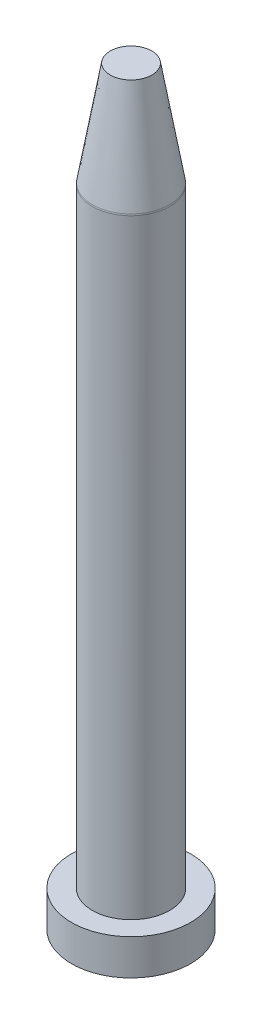
ISO-10303-21;
HEADER;
FILE_DESCRIPTION(('STEP AP214'),'2;1');
FILE_NAME('part.step','',(''),(''),'','','');
FILE_SCHEMA(('AUTOMOTIVE_DESIGN { 1 0 10303 214 1 1 1 1 }'));
ENDSEC;
DATA;
#1=APPLICATION_CONTEXT('core data for automotive mechanical design processes');
#2=APPLICATION_PROTOCOL_DEFINITION('international standard','automotive_design',2000,#1);
#3=PRODUCT_CONTEXT('',#1,'mechanical');
#4=PRODUCT('Part','Part','',(#3));
#5=PRODUCT_RELATED_PRODUCT_CATEGORY('part','',(#4));
#6=PRODUCT_DEFINITION_FORMATION('','',#4);
#7=PRODUCT_DEFINITION_CONTEXT('part definition',#1,'design');
#8=PRODUCT_DEFINITION('design','',#6,#7);
#9=PRODUCT_DEFINITION_SHAPE('','',#8);
#10=(LENGTH_UNIT() NAMED_UNIT(*) SI_UNIT(.MILLI.,.METRE.));
#11=(NAMED_UNIT(*) PLANE_ANGLE_UNIT() SI_UNIT($,.RADIAN.));
#12=(NAMED_UNIT(*) SI_UNIT($,.STERADIAN.) SOLID_ANGLE_UNIT());
#13=UNCERTAINTY_MEASURE_WITH_UNIT(LENGTH_MEASURE(1.E-05),#10,'distance_accuracy_value','');
#14=(GEOMETRIC_REPRESENTATION_CONTEXT(3) GLOBAL_UNCERTAINTY_ASSIGNED_CONTEXT((#13)) GLOBAL_UNIT_ASSIGNED_CONTEXT((#10,
#11,#12)) REPRESENTATION_CONTEXT('',''));
#15=CARTESIAN_POINT('',(0.,0.,0.));
#16=DIRECTION('',(0.,0.,1.));
#17=DIRECTION('',(1.,0.,0.));
#18=AXIS2_PLACEMENT_3D('',#15,#16,#17);
#19=CARTESIAN_POINT('',(0.,252.,0.));
#20=DIRECTION('',(0.,1.,0.));
#21=DIRECTION('',(0.,0.,1.));
#22=AXIS2_PLACEMENT_3D('',#19,#20,#21);
#23=PLANE('',#22);
#24=CARTESIAN_POINT('',(0.,252.,0.));
#25=DIRECTION('',(0.,-1.,0.));
#26=DIRECTION('',(0.,0.,-1.));
#27=AXIS2_PLACEMENT_3D('',#24,#25,#26);
#28=CIRCLE('',#27,7.);
#29=CARTESIAN_POINT('',(0.,252.,-7.));
#30=VERTEX_POINT('',#29);
#31=EDGE_CURVE('E43',#30,#30,#28,.T.);
#32=ORIENTED_EDGE('',*,*,#31,.F.);
#33=EDGE_LOOP('',(#32));
#34=FACE_BOUND('',#33,.T.);
#35=ADVANCED_FACE('F32',(#34),#23,.T.);
#36=CARTESIAN_POINT('',(0.,217.,0.));
#37=DIRECTION('',(0.,-1.,0.));
#38=DIRECTION('',(0.,0.,-1.));
#39=AXIS2_PLACEMENT_3D('',#36,#37,#38);
#40=CONICAL_SURFACE('',#39,13.,0.169778273968338);
#41=CARTESIAN_POINT('',(0.,217.251610540768,0.));
#42=DIRECTION('',(0.,1.,0.));
#43=DIRECTION('',(0.,0.,1.));
#44=AXIS2_PLACEMENT_3D('',#41,#42,#43);
#45=CIRCLE('',#44,12.9568667644398);
#46=CARTESIAN_POINT('',(0.,217.251610540768,12.9568667644398));
#47=VERTEX_POINT('',#46);
#48=EDGE_CURVE('E10',#47,#47,#45,.T.);
#49=ORIENTED_EDGE('',*,*,#48,.T.);
#50=EDGE_LOOP('',(#49));
#51=FACE_BOUND('',#50,.T.);
#52=ORIENTED_EDGE('',*,*,#31,.T.);
#53=EDGE_LOOP('',(#52));
#54=FACE_BOUND('',#53,.T.);
#55=ADVANCED_FACE('F75',(#51,#54),#40,.T.);
#56=CARTESIAN_POINT('',(0.,0.,0.));
#57=DIRECTION('',(0.,-1.,0.));
#58=DIRECTION('',(0.,0.,-1.));
#59=AXIS2_PLACEMENT_3D('',#56,#57,#58);
#60=CYLINDRICAL_SURFACE('',#59,13.);
#61=CARTESIAN_POINT('',(0.,216.744719095435,0.));
#62=DIRECTION('',(0.,1.,0.));
#63=DIRECTION('',(0.,0.,1.));
#64=AXIS2_PLACEMENT_3D('',#61,#62,#63);
#65=CIRCLE('',#64,13.);
#66=CARTESIAN_POINT('',(0.,216.744719095435,13.));
#67=VERTEX_POINT('',#66);
#68=EDGE_CURVE('E39',#67,#67,#65,.F.);
#69=ORIENTED_EDGE('',*,*,#68,.T.);
#70=EDGE_LOOP('',(#69));
#71=FACE_BOUND('',#70,.T.);
#72=CARTESIAN_POINT('',(0.,12.,0.));
#73=DIRECTION('',(0.,-1.,0.));
#74=DIRECTION('',(0.,0.,-1.));
#75=AXIS2_PLACEMENT_3D('',#72,#73,#74);
#76=CIRCLE('',#75,13.);
#77=CARTESIAN_POINT('',(0.,12.,-13.));
#78=VERTEX_POINT('',#77);
#79=EDGE_CURVE('E47',#78,#78,#76,.T.);
#80=ORIENTED_EDGE('',*,*,#79,.F.);
#81=EDGE_LOOP('',(#80));
#82=FACE_BOUND('',#81,.T.);
#83=ADVANCED_FACE('F71',(#71,#82),#60,.T.);
#84=CARTESIAN_POINT('',(20.,12.,0.));
#85=DIRECTION('',(0.,1.,0.));
#86=DIRECTION('',(0.,0.,1.));
#87=AXIS2_PLACEMENT_3D('',#84,#85,#86);
#88=PLANE('',#87);
#89=ORIENTED_EDGE('',*,*,#79,.T.);
#90=EDGE_LOOP('',(#89));
#91=FACE_BOUND('',#90,.T.);
#92=CARTESIAN_POINT('',(0.,12.,0.));
#93=DIRECTION('',(0.,-1.,0.));
#94=DIRECTION('',(0.,0.,-1.));
#95=AXIS2_PLACEMENT_3D('',#92,#93,#94);
#96=CIRCLE('',#95,20.);
#97=CARTESIAN_POINT('',(0.,12.,-20.));
#98=VERTEX_POINT('',#97);
#99=EDGE_CURVE('E52',#98,#98,#96,.T.);
#100=ORIENTED_EDGE('',*,*,#99,.F.);
#101=EDGE_LOOP('',(#100));
#102=FACE_BOUND('',#101,.T.);
#103=ADVANCED_FACE('F63',(#91,#102),#88,.T.);
#104=CARTESIAN_POINT('',(0.,0.,0.));
#105=DIRECTION('',(0.,-1.,0.));
#106=DIRECTION('',(0.,0.,-1.));
#107=AXIS2_PLACEMENT_3D('',#104,#105,#106);
#108=CYLINDRICAL_SURFACE('',#107,20.);
#109=ORIENTED_EDGE('',*,*,#99,.T.);
#110=EDGE_LOOP('',(#109));
#111=FACE_BOUND('',#110,.T.);
#112=CARTESIAN_POINT('',(0.,0.,0.));
#113=DIRECTION('',(0.,-1.,0.));
#114=DIRECTION('',(0.,0.,-1.));
#115=AXIS2_PLACEMENT_3D('',#112,#113,#114);
#116=CIRCLE('',#115,20.);
#117=CARTESIAN_POINT('',(0.,0.,-20.));
#118=VERTEX_POINT('',#117);
#119=EDGE_CURVE('E55',#118,#118,#116,.T.);
#120=ORIENTED_EDGE('',*,*,#119,.F.);
#121=EDGE_LOOP('',(#120));
#122=FACE_BOUND('',#121,.T.);
#123=ADVANCED_FACE('F61',(#111,#122),#108,.T.);
#124=CARTESIAN_POINT('',(0.,0.,0.));
#125=DIRECTION('',(0.,-1.,0.));
#126=DIRECTION('',(0.,0.,-1.));
#127=AXIS2_PLACEMENT_3D('',#124,#125,#126);
#128=PLANE('',#127);
#129=ORIENTED_EDGE('',*,*,#119,.T.);
#130=EDGE_LOOP('',(#129));
#131=FACE_BOUND('',#130,.T.);
#132=ADVANCED_FACE('F59',(#131),#128,.T.);
#133=CARTESIAN_POINT('',(0.,216.744719095435,0.));
#134=DIRECTION('',(0.,1.,0.));
#135=DIRECTION('',(0.,0.,1.));
#136=AXIS2_PLACEMENT_3D('',#133,#134,#135);
#137=TOROIDAL_SURFACE('',#136,10.,3.);
#138=ORIENTED_EDGE('',*,*,#48,.F.);
#139=EDGE_LOOP('',(#138));
#140=FACE_BOUND('',#139,.T.);
#141=ORIENTED_EDGE('',*,*,#68,.F.);
#142=EDGE_LOOP('',(#141));
#143=FACE_BOUND('',#142,.T.);
#144=ADVANCED_FACE('F34',(#140,#143),#137,.T.);
#145=CLOSED_SHELL('',(#35,#55,#83,#103,#123,#132,#144));
#146=MANIFOLD_SOLID_BREP('B2',#145);
#147=ADVANCED_BREP_SHAPE_REPRESENTATION('',(#18,#146),#14);
#148=SHAPE_DEFINITION_REPRESENTATION(#9,#147);
ENDSEC;
END-ISO-10303-21;
